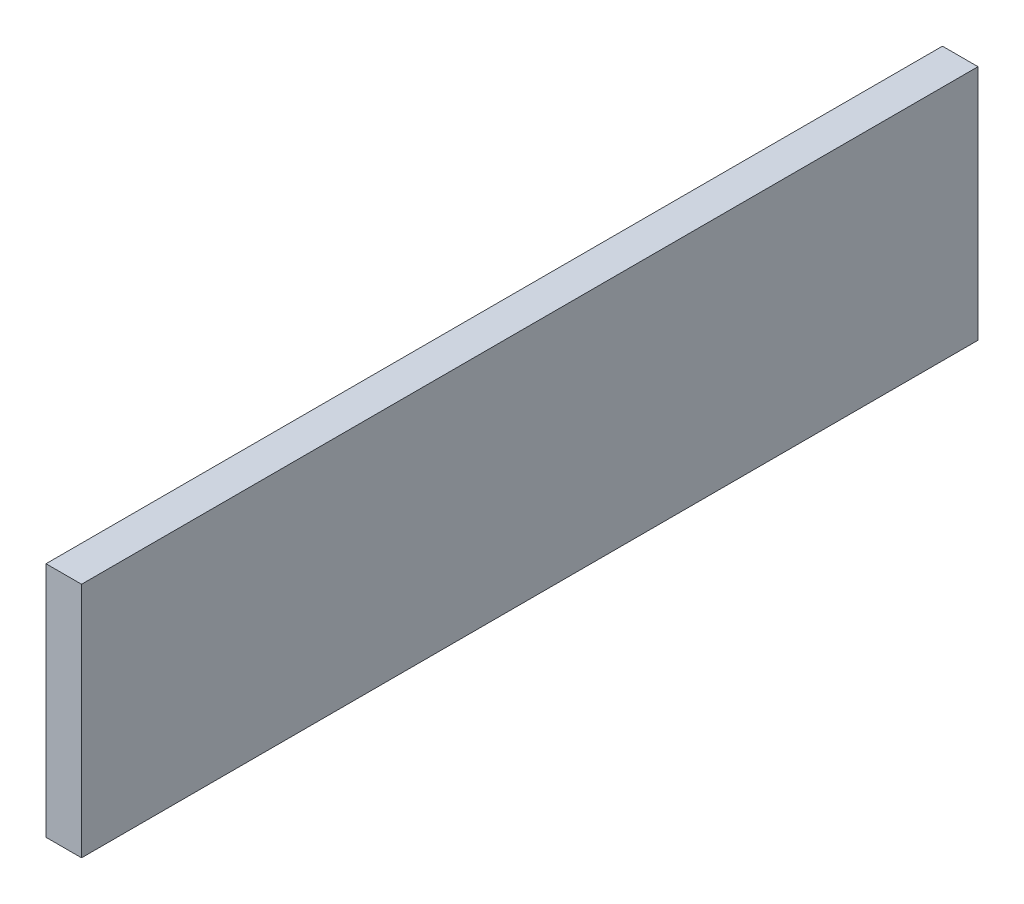
ISO-10303-21;
HEADER;
FILE_DESCRIPTION(('STEP AP214'),'2;1');
FILE_NAME('part.step','',(''),(''),'','','');
FILE_SCHEMA(('AUTOMOTIVE_DESIGN { 1 0 10303 214 1 1 1 1 }'));
ENDSEC;
DATA;
#1=APPLICATION_CONTEXT('core data for automotive mechanical design processes');
#2=APPLICATION_PROTOCOL_DEFINITION('international standard','automotive_design',2000,#1);
#3=PRODUCT_CONTEXT('',#1,'mechanical');
#4=PRODUCT('Part','Part','',(#3));
#5=PRODUCT_RELATED_PRODUCT_CATEGORY('part','',(#4));
#6=PRODUCT_DEFINITION_FORMATION('','',#4);
#7=PRODUCT_DEFINITION_CONTEXT('part definition',#1,'design');
#8=PRODUCT_DEFINITION('design','',#6,#7);
#9=PRODUCT_DEFINITION_SHAPE('','',#8);
#10=(LENGTH_UNIT() NAMED_UNIT(*) SI_UNIT(.MILLI.,.METRE.));
#11=(NAMED_UNIT(*) PLANE_ANGLE_UNIT() SI_UNIT($,.RADIAN.));
#12=(NAMED_UNIT(*) SI_UNIT($,.STERADIAN.) SOLID_ANGLE_UNIT());
#13=UNCERTAINTY_MEASURE_WITH_UNIT(LENGTH_MEASURE(1.E-05),#10,'distance_accuracy_value','');
#14=(GEOMETRIC_REPRESENTATION_CONTEXT(3) GLOBAL_UNCERTAINTY_ASSIGNED_CONTEXT((#13)) GLOBAL_UNIT_ASSIGNED_CONTEXT((#10,
#11,#12)) REPRESENTATION_CONTEXT('',''));
#15=CARTESIAN_POINT('',(0.,0.,0.));
#16=DIRECTION('',(0.,0.,1.));
#17=DIRECTION('',(1.,0.,0.));
#18=AXIS2_PLACEMENT_3D('',#15,#16,#17);
#19=CARTESIAN_POINT('',(18.,0.,0.));
#20=DIRECTION('',(0.,0.,-1.));
#21=DIRECTION('',(-1.,0.,0.));
#22=AXIS2_PLACEMENT_3D('',#19,#20,#21);
#23=PLANE('',#22);
#24=DIRECTION('',(0.,-1.,0.));
#25=VECTOR('',#24,1.);
#26=CARTESIAN_POINT('',(0.,0.,0.));
#27=LINE('',#26,#25);
#28=CARTESIAN_POINT('',(0.,120.,0.));
#29=VERTEX_POINT('',#28);
#30=CARTESIAN_POINT('',(0.,0.,0.));
#31=VERTEX_POINT('',#30);
#32=EDGE_CURVE('E96',#29,#31,#27,.T.);
#33=ORIENTED_EDGE('',*,*,#32,.T.);
#34=DIRECTION('',(-1.,0.,0.));
#35=VECTOR('',#34,1.);
#36=CARTESIAN_POINT('',(18.,0.,0.));
#37=LINE('',#36,#35);
#38=CARTESIAN_POINT('',(18.,0.,0.));
#39=VERTEX_POINT('',#38);
#40=EDGE_CURVE('E11',#39,#31,#37,.T.);
#41=ORIENTED_EDGE('',*,*,#40,.F.);
#42=DIRECTION('',(0.,-1.,0.));
#43=VECTOR('',#42,1.);
#44=CARTESIAN_POINT('',(18.,0.,0.));
#45=LINE('',#44,#43);
#46=CARTESIAN_POINT('',(18.,120.,0.));
#47=VERTEX_POINT('',#46);
#48=EDGE_CURVE('E84',#47,#39,#45,.T.);
#49=ORIENTED_EDGE('',*,*,#48,.F.);
#50=DIRECTION('',(-1.,0.,0.));
#51=VECTOR('',#50,1.);
#52=CARTESIAN_POINT('',(18.,120.,0.));
#53=LINE('',#52,#51);
#54=EDGE_CURVE('E92',#47,#29,#53,.T.);
#55=ORIENTED_EDGE('',*,*,#54,.T.);
#56=EDGE_LOOP('',(#33,#41,#49,#55));
#57=FACE_BOUND('',#56,.T.);
#58=ADVANCED_FACE('F33',(#57),#23,.F.);
#59=CARTESIAN_POINT('',(18.,0.,0.));
#60=DIRECTION('',(0.,1.,0.));
#61=DIRECTION('',(0.,0.,1.));
#62=AXIS2_PLACEMENT_3D('',#59,#60,#61);
#63=PLANE('',#62);
#64=DIRECTION('',(0.,0.,-1.));
#65=VECTOR('',#64,1.);
#66=CARTESIAN_POINT('',(0.,0.,0.));
#67=LINE('',#66,#65);
#68=CARTESIAN_POINT('',(0.,0.,-454.));
#69=VERTEX_POINT('',#68);
#70=EDGE_CURVE('E88',#31,#69,#67,.T.);
#71=ORIENTED_EDGE('',*,*,#70,.T.);
#72=DIRECTION('',(-1.,0.,0.));
#73=VECTOR('',#72,1.);
#74=CARTESIAN_POINT('',(18.,0.,-454.));
#75=LINE('',#74,#73);
#76=CARTESIAN_POINT('',(18.,0.,-454.));
#77=VERTEX_POINT('',#76);
#78=EDGE_CURVE('E41',#77,#69,#75,.T.);
#79=ORIENTED_EDGE('',*,*,#78,.F.);
#80=DIRECTION('',(0.,0.,-1.));
#81=VECTOR('',#80,1.);
#82=CARTESIAN_POINT('',(18.,0.,0.));
#83=LINE('',#82,#81);
#84=EDGE_CURVE('E79',#39,#77,#83,.T.);
#85=ORIENTED_EDGE('',*,*,#84,.F.);
#86=ORIENTED_EDGE('',*,*,#40,.T.);
#87=EDGE_LOOP('',(#71,#79,#85,#86));
#88=FACE_BOUND('',#87,.T.);
#89=ADVANCED_FACE('F87',(#88),#63,.F.);
#90=CARTESIAN_POINT('',(18.,0.,-454.));
#91=DIRECTION('',(0.,0.,1.));
#92=DIRECTION('',(1.,0.,0.));
#93=AXIS2_PLACEMENT_3D('',#90,#91,#92);
#94=PLANE('',#93);
#95=DIRECTION('',(0.,1.,0.));
#96=VECTOR('',#95,1.);
#97=CARTESIAN_POINT('',(0.,0.,-454.));
#98=LINE('',#97,#96);
#99=CARTESIAN_POINT('',(0.,120.,-454.));
#100=VERTEX_POINT('',#99);
#101=EDGE_CURVE('E66',#69,#100,#98,.T.);
#102=ORIENTED_EDGE('',*,*,#101,.T.);
#103=DIRECTION('',(-1.,0.,0.));
#104=VECTOR('',#103,1.);
#105=CARTESIAN_POINT('',(18.,120.,-454.));
#106=LINE('',#105,#104);
#107=CARTESIAN_POINT('',(18.,120.,-454.));
#108=VERTEX_POINT('',#107);
#109=EDGE_CURVE('E89',#108,#100,#106,.T.);
#110=ORIENTED_EDGE('',*,*,#109,.F.);
#111=DIRECTION('',(0.,1.,0.));
#112=VECTOR('',#111,1.);
#113=CARTESIAN_POINT('',(18.,0.,-454.));
#114=LINE('',#113,#112);
#115=EDGE_CURVE('E82',#77,#108,#114,.T.);
#116=ORIENTED_EDGE('',*,*,#115,.F.);
#117=ORIENTED_EDGE('',*,*,#78,.T.);
#118=EDGE_LOOP('',(#102,#110,#116,#117));
#119=FACE_BOUND('',#118,.T.);
#120=ADVANCED_FACE('F90',(#119),#94,.F.);
#121=CARTESIAN_POINT('',(18.,120.,0.));
#122=DIRECTION('',(0.,-1.,0.));
#123=DIRECTION('',(0.,0.,-1.));
#124=AXIS2_PLACEMENT_3D('',#121,#122,#123);
#125=PLANE('',#124);
#126=DIRECTION('',(0.,0.,1.));
#127=VECTOR('',#126,1.);
#128=CARTESIAN_POINT('',(0.,120.,0.));
#129=LINE('',#128,#127);
#130=EDGE_CURVE('E72',#100,#29,#129,.T.);
#131=ORIENTED_EDGE('',*,*,#130,.T.);
#132=ORIENTED_EDGE('',*,*,#54,.F.);
#133=DIRECTION('',(0.,0.,1.));
#134=VECTOR('',#133,1.);
#135=CARTESIAN_POINT('',(18.,120.,0.));
#136=LINE('',#135,#134);
#137=EDGE_CURVE('E49',#108,#47,#136,.T.);
#138=ORIENTED_EDGE('',*,*,#137,.F.);
#139=ORIENTED_EDGE('',*,*,#109,.T.);
#140=EDGE_LOOP('',(#131,#132,#138,#139));
#141=FACE_BOUND('',#140,.T.);
#142=ADVANCED_FACE('F103',(#141),#125,.F.);
#143=CARTESIAN_POINT('',(18.,0.,0.));
#144=DIRECTION('',(-1.,0.,0.));
#145=DIRECTION('',(0.,0.,1.));
#146=AXIS2_PLACEMENT_3D('',#143,#144,#145);
#147=PLANE('',#146);
#148=ORIENTED_EDGE('',*,*,#48,.T.);
#149=ORIENTED_EDGE('',*,*,#84,.T.);
#150=ORIENTED_EDGE('',*,*,#115,.T.);
#151=ORIENTED_EDGE('',*,*,#137,.T.);
#152=EDGE_LOOP('',(#148,#149,#150,#151));
#153=FACE_BOUND('',#152,.T.);
#154=ADVANCED_FACE('F80',(#153),#147,.F.);
#155=CARTESIAN_POINT('',(0.,0.,0.));
#156=DIRECTION('',(-1.,0.,0.));
#157=DIRECTION('',(0.,0.,1.));
#158=AXIS2_PLACEMENT_3D('',#155,#156,#157);
#159=PLANE('',#158);
#160=ORIENTED_EDGE('',*,*,#32,.F.);
#161=ORIENTED_EDGE('',*,*,#130,.F.);
#162=ORIENTED_EDGE('',*,*,#101,.F.);
#163=ORIENTED_EDGE('',*,*,#70,.F.);
#164=EDGE_LOOP('',(#160,#161,#162,#163));
#165=FACE_BOUND('',#164,.T.);
#166=ADVANCED_FACE('F106',(#165),#159,.T.);
#167=CLOSED_SHELL('',(#58,#89,#120,#142,#154,#166));
#168=MANIFOLD_SOLID_BREP('B2',#167);
#169=ADVANCED_BREP_SHAPE_REPRESENTATION('',(#18,#168),#14);
#170=SHAPE_DEFINITION_REPRESENTATION(#9,#169);
ENDSEC;
END-ISO-10303-21;
